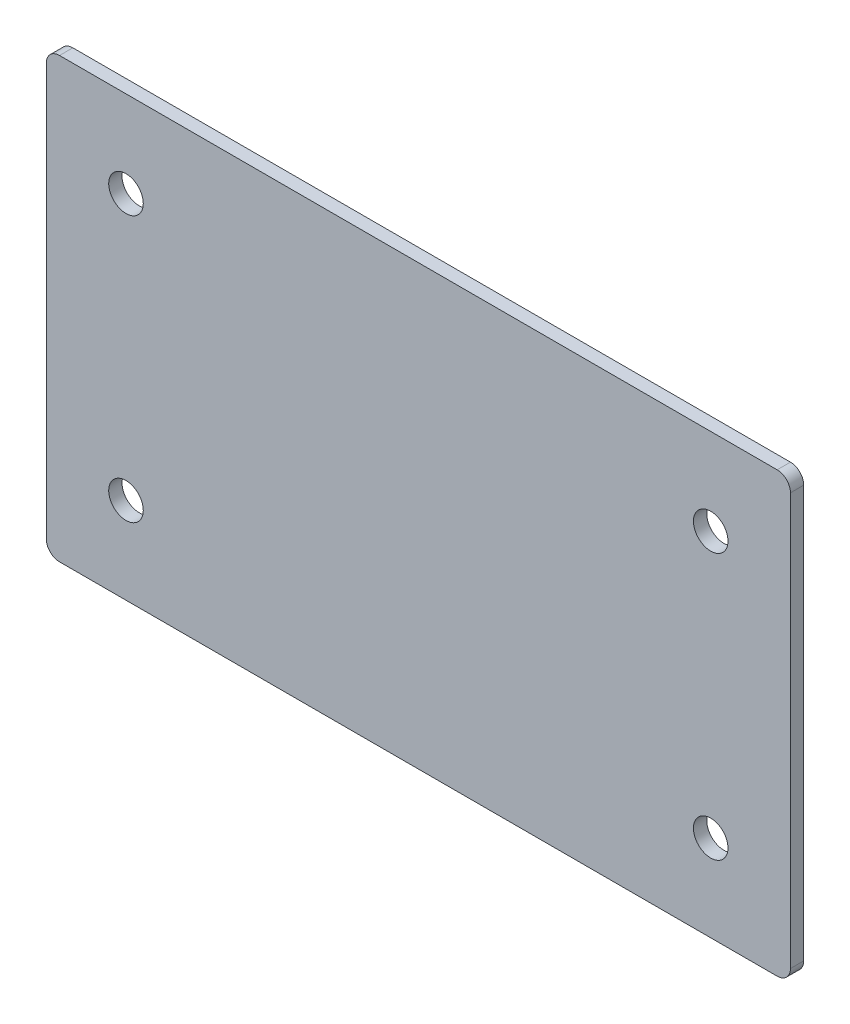
ISO-10303-21;
HEADER;
FILE_DESCRIPTION(('STEP AP214'),'2;1');
FILE_NAME('part.step','',(''),(''),'','','');
FILE_SCHEMA(('AUTOMOTIVE_DESIGN { 1 0 10303 214 1 1 1 1 }'));
ENDSEC;
DATA;
#1=APPLICATION_CONTEXT('core data for automotive mechanical design processes');
#2=APPLICATION_PROTOCOL_DEFINITION('international standard','automotive_design',2000,#1);
#3=PRODUCT_CONTEXT('',#1,'mechanical');
#4=PRODUCT('Part','Part','',(#3));
#5=PRODUCT_RELATED_PRODUCT_CATEGORY('part','',(#4));
#6=PRODUCT_DEFINITION_FORMATION('','',#4);
#7=PRODUCT_DEFINITION_CONTEXT('part definition',#1,'design');
#8=PRODUCT_DEFINITION('design','',#6,#7);
#9=PRODUCT_DEFINITION_SHAPE('','',#8);
#10=(LENGTH_UNIT() NAMED_UNIT(*) SI_UNIT(.MILLI.,.METRE.));
#11=(NAMED_UNIT(*) PLANE_ANGLE_UNIT() SI_UNIT($,.RADIAN.));
#12=(NAMED_UNIT(*) SI_UNIT($,.STERADIAN.) SOLID_ANGLE_UNIT());
#13=UNCERTAINTY_MEASURE_WITH_UNIT(LENGTH_MEASURE(1.E-05),#10,'distance_accuracy_value','');
#14=(GEOMETRIC_REPRESENTATION_CONTEXT(3) GLOBAL_UNCERTAINTY_ASSIGNED_CONTEXT((#13)) GLOBAL_UNIT_ASSIGNED_CONTEXT((#10,
#11,#12)) REPRESENTATION_CONTEXT('',''));
#15=CARTESIAN_POINT('',(0.,0.,0.));
#16=DIRECTION('',(0.,0.,1.));
#17=DIRECTION('',(1.,0.,0.));
#18=AXIS2_PLACEMENT_3D('',#15,#16,#17);
#19=CARTESIAN_POINT('',(140.,82.5,5.));
#20=DIRECTION('',(-1.,0.,0.));
#21=DIRECTION('',(0.,0.,1.));
#22=AXIS2_PLACEMENT_3D('',#19,#20,#21);
#23=PLANE('',#22);
#24=DIRECTION('',(0.,1.,0.));
#25=VECTOR('',#24,1.);
#26=CARTESIAN_POINT('',(140.,82.5,5.));
#27=LINE('',#26,#25);
#28=CARTESIAN_POINT('',(140.,-77.5,5.));
#29=VERTEX_POINT('',#28);
#30=CARTESIAN_POINT('',(140.,77.5,5.));
#31=VERTEX_POINT('',#30);
#32=EDGE_CURVE('E126',#29,#31,#27,.T.);
#33=ORIENTED_EDGE('',*,*,#32,.F.);
#34=DIRECTION('',(0.,0.,-1.));
#35=VECTOR('',#34,1.);
#36=CARTESIAN_POINT('',(140.,-77.5,5.));
#37=LINE('',#36,#35);
#38=CARTESIAN_POINT('',(140.,-77.5,0.));
#39=VERTEX_POINT('',#38);
#40=EDGE_CURVE('E166',#29,#39,#37,.T.);
#41=ORIENTED_EDGE('',*,*,#40,.T.);
#42=DIRECTION('',(0.,1.,0.));
#43=VECTOR('',#42,1.);
#44=CARTESIAN_POINT('',(140.,82.5,0.));
#45=LINE('',#44,#43);
#46=CARTESIAN_POINT('',(140.,77.5,0.));
#47=VERTEX_POINT('',#46);
#48=EDGE_CURVE('E148',#39,#47,#45,.T.);
#49=ORIENTED_EDGE('',*,*,#48,.T.);
#50=DIRECTION('',(0.,0.,-1.));
#51=VECTOR('',#50,1.);
#52=CARTESIAN_POINT('',(140.,77.5,5.));
#53=LINE('',#52,#51);
#54=EDGE_CURVE('E164',#47,#31,#53,.F.);
#55=ORIENTED_EDGE('',*,*,#54,.T.);
#56=EDGE_LOOP('',(#33,#41,#49,#55));
#57=FACE_BOUND('',#56,.T.);
#58=ADVANCED_FACE('F34',(#57),#23,.F.);
#59=CARTESIAN_POINT('',(-140.,82.5,5.));
#60=DIRECTION('',(0.,-1.,0.));
#61=DIRECTION('',(0.,0.,-1.));
#62=AXIS2_PLACEMENT_3D('',#59,#60,#61);
#63=PLANE('',#62);
#64=DIRECTION('',(-1.,0.,0.));
#65=VECTOR('',#64,1.);
#66=CARTESIAN_POINT('',(-140.,82.5,5.));
#67=LINE('',#66,#65);
#68=CARTESIAN_POINT('',(135.,82.5,5.));
#69=VERTEX_POINT('',#68);
#70=CARTESIAN_POINT('',(-135.,82.5,5.));
#71=VERTEX_POINT('',#70);
#72=EDGE_CURVE('E129',#69,#71,#67,.T.);
#73=ORIENTED_EDGE('',*,*,#72,.F.);
#74=DIRECTION('',(0.,0.,-1.));
#75=VECTOR('',#74,1.);
#76=CARTESIAN_POINT('',(135.,82.5,5.));
#77=LINE('',#76,#75);
#78=CARTESIAN_POINT('',(135.,82.5,0.));
#79=VERTEX_POINT('',#78);
#80=EDGE_CURVE('E11',#69,#79,#77,.T.);
#81=ORIENTED_EDGE('',*,*,#80,.T.);
#82=DIRECTION('',(-1.,0.,0.));
#83=VECTOR('',#82,1.);
#84=CARTESIAN_POINT('',(-140.,82.5,0.));
#85=LINE('',#84,#83);
#86=CARTESIAN_POINT('',(-135.,82.5,0.));
#87=VERTEX_POINT('',#86);
#88=EDGE_CURVE('E131',#79,#87,#85,.T.);
#89=ORIENTED_EDGE('',*,*,#88,.T.);
#90=DIRECTION('',(0.,0.,-1.));
#91=VECTOR('',#90,1.);
#92=CARTESIAN_POINT('',(-135.,82.5,5.));
#93=LINE('',#92,#91);
#94=EDGE_CURVE('E42',#87,#71,#93,.F.);
#95=ORIENTED_EDGE('',*,*,#94,.T.);
#96=EDGE_LOOP('',(#73,#81,#89,#95));
#97=FACE_BOUND('',#96,.T.);
#98=ADVANCED_FACE('F210',(#97),#63,.F.);
#99=CARTESIAN_POINT('',(-140.,82.5,5.));
#100=DIRECTION('',(1.,0.,0.));
#101=DIRECTION('',(0.,0.,-1.));
#102=AXIS2_PLACEMENT_3D('',#99,#100,#101);
#103=PLANE('',#102);
#104=DIRECTION('',(0.,-1.,0.));
#105=VECTOR('',#104,1.);
#106=CARTESIAN_POINT('',(-140.,82.5,0.));
#107=LINE('',#106,#105);
#108=CARTESIAN_POINT('',(-140.,77.5,0.));
#109=VERTEX_POINT('',#108);
#110=CARTESIAN_POINT('',(-140.,-77.5,0.));
#111=VERTEX_POINT('',#110);
#112=EDGE_CURVE('E127',#109,#111,#107,.T.);
#113=ORIENTED_EDGE('',*,*,#112,.T.);
#114=DIRECTION('',(0.,0.,-1.));
#115=VECTOR('',#114,1.);
#116=CARTESIAN_POINT('',(-140.,-77.5,5.));
#117=LINE('',#116,#115);
#118=CARTESIAN_POINT('',(-140.,-77.5,5.));
#119=VERTEX_POINT('',#118);
#120=EDGE_CURVE('E105',#111,#119,#117,.F.);
#121=ORIENTED_EDGE('',*,*,#120,.T.);
#122=DIRECTION('',(0.,-1.,0.));
#123=VECTOR('',#122,1.);
#124=CARTESIAN_POINT('',(-140.,82.5,5.));
#125=LINE('',#124,#123);
#126=CARTESIAN_POINT('',(-140.,77.5,5.));
#127=VERTEX_POINT('',#126);
#128=EDGE_CURVE('E179',#127,#119,#125,.T.);
#129=ORIENTED_EDGE('',*,*,#128,.F.);
#130=DIRECTION('',(0.,0.,-1.));
#131=VECTOR('',#130,1.);
#132=CARTESIAN_POINT('',(-140.,77.5,5.));
#133=LINE('',#132,#131);
#134=EDGE_CURVE('E110',#127,#109,#133,.T.);
#135=ORIENTED_EDGE('',*,*,#134,.T.);
#136=EDGE_LOOP('',(#113,#121,#129,#135));
#137=FACE_BOUND('',#136,.T.);
#138=ADVANCED_FACE('F208',(#137),#103,.F.);
#139=CARTESIAN_POINT('',(-140.,-82.5,5.));
#140=DIRECTION('',(0.,1.,0.));
#141=DIRECTION('',(0.,0.,1.));
#142=AXIS2_PLACEMENT_3D('',#139,#140,#141);
#143=PLANE('',#142);
#144=DIRECTION('',(1.,0.,0.));
#145=VECTOR('',#144,1.);
#146=CARTESIAN_POINT('',(-140.,-82.5,5.));
#147=LINE('',#146,#145);
#148=CARTESIAN_POINT('',(-135.,-82.5,5.));
#149=VERTEX_POINT('',#148);
#150=CARTESIAN_POINT('',(135.,-82.5,5.));
#151=VERTEX_POINT('',#150);
#152=EDGE_CURVE('E120',#149,#151,#147,.T.);
#153=ORIENTED_EDGE('',*,*,#152,.F.);
#154=DIRECTION('',(0.,0.,-1.));
#155=VECTOR('',#154,1.);
#156=CARTESIAN_POINT('',(-135.,-82.5,5.));
#157=LINE('',#156,#155);
#158=CARTESIAN_POINT('',(-135.,-82.5,0.));
#159=VERTEX_POINT('',#158);
#160=EDGE_CURVE('E104',#149,#159,#157,.T.);
#161=ORIENTED_EDGE('',*,*,#160,.T.);
#162=DIRECTION('',(1.,0.,0.));
#163=VECTOR('',#162,1.);
#164=CARTESIAN_POINT('',(-140.,-82.5,0.));
#165=LINE('',#164,#163);
#166=CARTESIAN_POINT('',(135.,-82.5,0.));
#167=VERTEX_POINT('',#166);
#168=EDGE_CURVE('E117',#159,#167,#165,.T.);
#169=ORIENTED_EDGE('',*,*,#168,.T.);
#170=DIRECTION('',(0.,0.,-1.));
#171=VECTOR('',#170,1.);
#172=CARTESIAN_POINT('',(135.,-82.5,5.));
#173=LINE('',#172,#171);
#174=EDGE_CURVE('E122',#167,#151,#173,.F.);
#175=ORIENTED_EDGE('',*,*,#174,.T.);
#176=EDGE_LOOP('',(#153,#161,#169,#175));
#177=FACE_BOUND('',#176,.T.);
#178=ADVANCED_FACE('F116',(#177),#143,.F.);
#179=CARTESIAN_POINT('',(0.,0.,5.));
#180=DIRECTION('',(0.,0.,1.));
#181=DIRECTION('',(1.,0.,0.));
#182=AXIS2_PLACEMENT_3D('',#179,#180,#181);
#183=PLANE('',#182);
#184=CARTESIAN_POINT('',(110.,50.,5.));
#185=DIRECTION('',(0.,0.,1.));
#186=DIRECTION('',(1.,0.,0.));
#187=AXIS2_PLACEMENT_3D('',#184,#185,#186);
#188=CIRCLE('',#187,6.5);
#189=CARTESIAN_POINT('',(116.5,50.,5.));
#190=VERTEX_POINT('',#189);
#191=EDGE_CURVE('E185',#190,#190,#188,.T.);
#192=ORIENTED_EDGE('',*,*,#191,.F.);
#193=EDGE_LOOP('',(#192));
#194=FACE_BOUND('',#193,.T.);
#195=CARTESIAN_POINT('',(-110.,-50.,5.));
#196=DIRECTION('',(0.,0.,1.));
#197=DIRECTION('',(1.,0.,0.));
#198=AXIS2_PLACEMENT_3D('',#195,#196,#197);
#199=CIRCLE('',#198,6.5);
#200=CARTESIAN_POINT('',(-103.5,-50.,5.));
#201=VERTEX_POINT('',#200);
#202=EDGE_CURVE('E186',#201,#201,#199,.T.);
#203=ORIENTED_EDGE('',*,*,#202,.F.);
#204=EDGE_LOOP('',(#203));
#205=FACE_BOUND('',#204,.T.);
#206=CARTESIAN_POINT('',(110.,-50.,5.));
#207=DIRECTION('',(0.,0.,1.));
#208=DIRECTION('',(1.,0.,0.));
#209=AXIS2_PLACEMENT_3D('',#206,#207,#208);
#210=CIRCLE('',#209,6.5);
#211=CARTESIAN_POINT('',(116.5,-50.,5.));
#212=VERTEX_POINT('',#211);
#213=EDGE_CURVE('E189',#212,#212,#210,.T.);
#214=ORIENTED_EDGE('',*,*,#213,.F.);
#215=EDGE_LOOP('',(#214));
#216=FACE_BOUND('',#215,.T.);
#217=CARTESIAN_POINT('',(-110.,50.,5.));
#218=DIRECTION('',(0.,0.,1.));
#219=DIRECTION('',(1.,0.,0.));
#220=AXIS2_PLACEMENT_3D('',#217,#218,#219);
#221=CIRCLE('',#220,6.5);
#222=CARTESIAN_POINT('',(-103.5,50.,5.));
#223=VERTEX_POINT('',#222);
#224=EDGE_CURVE('E139',#223,#223,#221,.T.);
#225=ORIENTED_EDGE('',*,*,#224,.F.);
#226=EDGE_LOOP('',(#225));
#227=FACE_BOUND('',#226,.T.);
#228=ORIENTED_EDGE('',*,*,#128,.T.);
#229=CARTESIAN_POINT('',(-135.,-77.5,5.));
#230=DIRECTION('',(0.,0.,1.));
#231=DIRECTION('',(1.,0.,0.));
#232=AXIS2_PLACEMENT_3D('',#229,#230,#231);
#233=CIRCLE('',#232,5.);
#234=EDGE_CURVE('E162',#119,#149,#233,.T.);
#235=ORIENTED_EDGE('',*,*,#234,.T.);
#236=ORIENTED_EDGE('',*,*,#152,.T.);
#237=CARTESIAN_POINT('',(135.,-77.5,5.));
#238=DIRECTION('',(0.,0.,1.));
#239=DIRECTION('',(1.,0.,0.));
#240=AXIS2_PLACEMENT_3D('',#237,#238,#239);
#241=CIRCLE('',#240,5.);
#242=EDGE_CURVE('E160',#151,#29,#241,.T.);
#243=ORIENTED_EDGE('',*,*,#242,.T.);
#244=ORIENTED_EDGE('',*,*,#32,.T.);
#245=CARTESIAN_POINT('',(135.,77.5,5.));
#246=DIRECTION('',(0.,0.,1.));
#247=DIRECTION('',(1.,0.,0.));
#248=AXIS2_PLACEMENT_3D('',#245,#246,#247);
#249=CIRCLE('',#248,5.);
#250=EDGE_CURVE('E55',#31,#69,#249,.T.);
#251=ORIENTED_EDGE('',*,*,#250,.T.);
#252=ORIENTED_EDGE('',*,*,#72,.T.);
#253=CARTESIAN_POINT('',(-135.,77.5,5.));
#254=DIRECTION('',(0.,0.,1.));
#255=DIRECTION('',(1.,0.,0.));
#256=AXIS2_PLACEMENT_3D('',#253,#254,#255);
#257=CIRCLE('',#256,5.);
#258=EDGE_CURVE('E157',#71,#127,#257,.T.);
#259=ORIENTED_EDGE('',*,*,#258,.T.);
#260=EDGE_LOOP('',(#228,#235,#236,#243,#244,#251,#252,#259));
#261=FACE_BOUND('',#260,.T.);
#262=ADVANCED_FACE('F198',(#194,#205,#216,#227,#261),#183,.T.);
#263=CARTESIAN_POINT('',(0.,0.,0.));
#264=DIRECTION('',(0.,0.,1.));
#265=DIRECTION('',(1.,0.,0.));
#266=AXIS2_PLACEMENT_3D('',#263,#264,#265);
#267=PLANE('',#266);
#268=CARTESIAN_POINT('',(110.,50.,0.));
#269=DIRECTION('',(0.,0.,1.));
#270=DIRECTION('',(1.,0.,0.));
#271=AXIS2_PLACEMENT_3D('',#268,#269,#270);
#272=CIRCLE('',#271,6.5);
#273=CARTESIAN_POINT('',(116.5,50.,0.));
#274=VERTEX_POINT('',#273);
#275=EDGE_CURVE('E145',#274,#274,#272,.T.);
#276=ORIENTED_EDGE('',*,*,#275,.T.);
#277=EDGE_LOOP('',(#276));
#278=FACE_BOUND('',#277,.T.);
#279=CARTESIAN_POINT('',(-110.,-50.,0.));
#280=DIRECTION('',(0.,0.,1.));
#281=DIRECTION('',(1.,0.,0.));
#282=AXIS2_PLACEMENT_3D('',#279,#280,#281);
#283=CIRCLE('',#282,6.5);
#284=CARTESIAN_POINT('',(-103.5,-50.,0.));
#285=VERTEX_POINT('',#284);
#286=EDGE_CURVE('E142',#285,#285,#283,.T.);
#287=ORIENTED_EDGE('',*,*,#286,.T.);
#288=EDGE_LOOP('',(#287));
#289=FACE_BOUND('',#288,.T.);
#290=CARTESIAN_POINT('',(110.,-50.,0.));
#291=DIRECTION('',(0.,0.,1.));
#292=DIRECTION('',(1.,0.,0.));
#293=AXIS2_PLACEMENT_3D('',#290,#291,#292);
#294=CIRCLE('',#293,6.5);
#295=CARTESIAN_POINT('',(116.5,-50.,0.));
#296=VERTEX_POINT('',#295);
#297=EDGE_CURVE('E138',#296,#296,#294,.T.);
#298=ORIENTED_EDGE('',*,*,#297,.T.);
#299=EDGE_LOOP('',(#298));
#300=FACE_BOUND('',#299,.T.);
#301=CARTESIAN_POINT('',(-110.,50.,0.));
#302=DIRECTION('',(0.,0.,1.));
#303=DIRECTION('',(1.,0.,0.));
#304=AXIS2_PLACEMENT_3D('',#301,#302,#303);
#305=CIRCLE('',#304,6.5);
#306=CARTESIAN_POINT('',(-103.5,50.,0.));
#307=VERTEX_POINT('',#306);
#308=EDGE_CURVE('E135',#307,#307,#305,.T.);
#309=ORIENTED_EDGE('',*,*,#308,.T.);
#310=EDGE_LOOP('',(#309));
#311=FACE_BOUND('',#310,.T.);
#312=ORIENTED_EDGE('',*,*,#168,.F.);
#313=CARTESIAN_POINT('',(-135.,-77.5,0.));
#314=DIRECTION('',(0.,0.,1.));
#315=DIRECTION('',(1.,0.,0.));
#316=AXIS2_PLACEMENT_3D('',#313,#314,#315);
#317=CIRCLE('',#316,5.);
#318=EDGE_CURVE('E100',#159,#111,#317,.F.);
#319=ORIENTED_EDGE('',*,*,#318,.T.);
#320=ORIENTED_EDGE('',*,*,#112,.F.);
#321=CARTESIAN_POINT('',(-135.,77.5,0.));
#322=DIRECTION('',(0.,0.,1.));
#323=DIRECTION('',(1.,0.,0.));
#324=AXIS2_PLACEMENT_3D('',#321,#322,#323);
#325=CIRCLE('',#324,5.);
#326=EDGE_CURVE('E121',#109,#87,#325,.F.);
#327=ORIENTED_EDGE('',*,*,#326,.T.);
#328=ORIENTED_EDGE('',*,*,#88,.F.);
#329=CARTESIAN_POINT('',(135.,77.5,0.));
#330=DIRECTION('',(0.,0.,1.));
#331=DIRECTION('',(1.,0.,0.));
#332=AXIS2_PLACEMENT_3D('',#329,#330,#331);
#333=CIRCLE('',#332,5.);
#334=EDGE_CURVE('E151',#79,#47,#333,.F.);
#335=ORIENTED_EDGE('',*,*,#334,.T.);
#336=ORIENTED_EDGE('',*,*,#48,.F.);
#337=CARTESIAN_POINT('',(135.,-77.5,0.));
#338=DIRECTION('',(0.,0.,1.));
#339=DIRECTION('',(1.,0.,0.));
#340=AXIS2_PLACEMENT_3D('',#337,#338,#339);
#341=CIRCLE('',#340,5.);
#342=EDGE_CURVE('E111',#39,#167,#341,.F.);
#343=ORIENTED_EDGE('',*,*,#342,.T.);
#344=EDGE_LOOP('',(#312,#319,#320,#327,#328,#335,#336,#343));
#345=FACE_BOUND('',#344,.T.);
#346=ADVANCED_FACE('F124',(#278,#289,#300,#311,#345),#267,.F.);
#347=CARTESIAN_POINT('',(-110.,50.,-1.));
#348=DIRECTION('',(0.,0.,1.));
#349=DIRECTION('',(1.,0.,0.));
#350=AXIS2_PLACEMENT_3D('',#347,#348,#349);
#351=CYLINDRICAL_SURFACE('',#350,6.5);
#352=ORIENTED_EDGE('',*,*,#224,.T.);
#353=EDGE_LOOP('',(#352));
#354=FACE_BOUND('',#353,.T.);
#355=ORIENTED_EDGE('',*,*,#308,.F.);
#356=EDGE_LOOP('',(#355));
#357=FACE_BOUND('',#356,.T.);
#358=ADVANCED_FACE('F235',(#354,#357),#351,.F.);
#359=CARTESIAN_POINT('',(110.,-50.,-1.));
#360=DIRECTION('',(0.,0.,1.));
#361=DIRECTION('',(1.,0.,0.));
#362=AXIS2_PLACEMENT_3D('',#359,#360,#361);
#363=CYLINDRICAL_SURFACE('',#362,6.5);
#364=ORIENTED_EDGE('',*,*,#213,.T.);
#365=EDGE_LOOP('',(#364));
#366=FACE_BOUND('',#365,.T.);
#367=ORIENTED_EDGE('',*,*,#297,.F.);
#368=EDGE_LOOP('',(#367));
#369=FACE_BOUND('',#368,.T.);
#370=ADVANCED_FACE('F195',(#366,#369),#363,.F.);
#371=CARTESIAN_POINT('',(-110.,-50.,-1.));
#372=DIRECTION('',(0.,0.,1.));
#373=DIRECTION('',(1.,0.,0.));
#374=AXIS2_PLACEMENT_3D('',#371,#372,#373);
#375=CYLINDRICAL_SURFACE('',#374,6.5);
#376=ORIENTED_EDGE('',*,*,#202,.T.);
#377=EDGE_LOOP('',(#376));
#378=FACE_BOUND('',#377,.T.);
#379=ORIENTED_EDGE('',*,*,#286,.F.);
#380=EDGE_LOOP('',(#379));
#381=FACE_BOUND('',#380,.T.);
#382=ADVANCED_FACE('F241',(#378,#381),#375,.F.);
#383=CARTESIAN_POINT('',(110.,50.,-1.));
#384=DIRECTION('',(0.,0.,1.));
#385=DIRECTION('',(1.,0.,0.));
#386=AXIS2_PLACEMENT_3D('',#383,#384,#385);
#387=CYLINDRICAL_SURFACE('',#386,6.5);
#388=ORIENTED_EDGE('',*,*,#191,.T.);
#389=EDGE_LOOP('',(#388));
#390=FACE_BOUND('',#389,.T.);
#391=ORIENTED_EDGE('',*,*,#275,.F.);
#392=EDGE_LOOP('',(#391));
#393=FACE_BOUND('',#392,.T.);
#394=ADVANCED_FACE('F221',(#390,#393),#387,.F.);
#395=CARTESIAN_POINT('',(-135.,-77.5,5.));
#396=DIRECTION('',(0.,0.,-1.));
#397=DIRECTION('',(-1.,0.,0.));
#398=AXIS2_PLACEMENT_3D('',#395,#396,#397);
#399=CYLINDRICAL_SURFACE('',#398,5.);
#400=ORIENTED_EDGE('',*,*,#234,.F.);
#401=ORIENTED_EDGE('',*,*,#120,.F.);
#402=ORIENTED_EDGE('',*,*,#318,.F.);
#403=ORIENTED_EDGE('',*,*,#160,.F.);
#404=EDGE_LOOP('',(#400,#401,#402,#403));
#405=FACE_BOUND('',#404,.T.);
#406=ADVANCED_FACE('F103',(#405),#399,.T.);
#407=CARTESIAN_POINT('',(135.,-77.5,5.));
#408=DIRECTION('',(0.,0.,-1.));
#409=DIRECTION('',(-1.,0.,0.));
#410=AXIS2_PLACEMENT_3D('',#407,#408,#409);
#411=CYLINDRICAL_SURFACE('',#410,5.);
#412=ORIENTED_EDGE('',*,*,#242,.F.);
#413=ORIENTED_EDGE('',*,*,#174,.F.);
#414=ORIENTED_EDGE('',*,*,#342,.F.);
#415=ORIENTED_EDGE('',*,*,#40,.F.);
#416=EDGE_LOOP('',(#412,#413,#414,#415));
#417=FACE_BOUND('',#416,.T.);
#418=ADVANCED_FACE('F214',(#417),#411,.T.);
#419=CARTESIAN_POINT('',(135.,77.5,5.));
#420=DIRECTION('',(0.,0.,-1.));
#421=DIRECTION('',(-1.,0.,0.));
#422=AXIS2_PLACEMENT_3D('',#419,#420,#421);
#423=CYLINDRICAL_SURFACE('',#422,5.);
#424=ORIENTED_EDGE('',*,*,#250,.F.);
#425=ORIENTED_EDGE('',*,*,#54,.F.);
#426=ORIENTED_EDGE('',*,*,#334,.F.);
#427=ORIENTED_EDGE('',*,*,#80,.F.);
#428=EDGE_LOOP('',(#424,#425,#426,#427));
#429=FACE_BOUND('',#428,.T.);
#430=ADVANCED_FACE('F213',(#429),#423,.T.);
#431=CARTESIAN_POINT('',(-135.,77.5,5.));
#432=DIRECTION('',(0.,0.,-1.));
#433=DIRECTION('',(-1.,0.,0.));
#434=AXIS2_PLACEMENT_3D('',#431,#432,#433);
#435=CYLINDRICAL_SURFACE('',#434,5.);
#436=ORIENTED_EDGE('',*,*,#258,.F.);
#437=ORIENTED_EDGE('',*,*,#94,.F.);
#438=ORIENTED_EDGE('',*,*,#326,.F.);
#439=ORIENTED_EDGE('',*,*,#134,.F.);
#440=EDGE_LOOP('',(#436,#437,#438,#439));
#441=FACE_BOUND('',#440,.T.);
#442=ADVANCED_FACE('F36',(#441),#435,.T.);
#443=CLOSED_SHELL('',(#58,#98,#138,#178,#262,#346,#358,#370,#382,#394,#406,#418,#430,#442));
#444=MANIFOLD_SOLID_BREP('B2',#443);
#445=ADVANCED_BREP_SHAPE_REPRESENTATION('',(#18,#444),#14);
#446=SHAPE_DEFINITION_REPRESENTATION(#9,#445);
ENDSEC;
END-ISO-10303-21;
